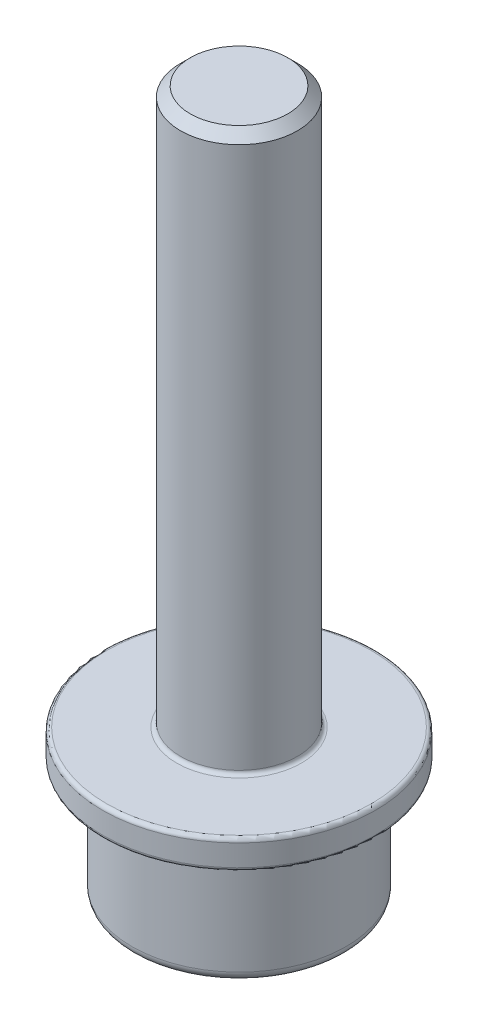
ISO-10303-21;
HEADER;
FILE_DESCRIPTION(('STEP AP214'),'2;1');
FILE_NAME('part.step','',(''),(''),'','','');
FILE_SCHEMA(('AUTOMOTIVE_DESIGN { 1 0 10303 214 1 1 1 1 }'));
ENDSEC;
DATA;
#1=APPLICATION_CONTEXT('core data for automotive mechanical design processes');
#2=APPLICATION_PROTOCOL_DEFINITION('international standard','automotive_design',2000,#1);
#3=PRODUCT_CONTEXT('',#1,'mechanical');
#4=PRODUCT('Part','Part','',(#3));
#5=PRODUCT_RELATED_PRODUCT_CATEGORY('part','',(#4));
#6=PRODUCT_DEFINITION_FORMATION('','',#4);
#7=PRODUCT_DEFINITION_CONTEXT('part definition',#1,'design');
#8=PRODUCT_DEFINITION('design','',#6,#7);
#9=PRODUCT_DEFINITION_SHAPE('','',#8);
#10=(LENGTH_UNIT() NAMED_UNIT(*) SI_UNIT(.MILLI.,.METRE.));
#11=(NAMED_UNIT(*) PLANE_ANGLE_UNIT() SI_UNIT($,.RADIAN.));
#12=(NAMED_UNIT(*) SI_UNIT($,.STERADIAN.) SOLID_ANGLE_UNIT());
#13=UNCERTAINTY_MEASURE_WITH_UNIT(LENGTH_MEASURE(1.E-05),#10,'distance_accuracy_value','');
#14=(GEOMETRIC_REPRESENTATION_CONTEXT(3) GLOBAL_UNCERTAINTY_ASSIGNED_CONTEXT((#13)) GLOBAL_UNIT_ASSIGNED_CONTEXT((#10,
#11,#12)) REPRESENTATION_CONTEXT('',''));
#15=CARTESIAN_POINT('',(0.,0.,0.));
#16=DIRECTION('',(0.,0.,1.));
#17=DIRECTION('',(1.,0.,0.));
#18=AXIS2_PLACEMENT_3D('',#15,#16,#17);
#19=CARTESIAN_POINT('',(0.,3.,0.));
#20=DIRECTION('',(0.,-1.,0.));
#21=DIRECTION('',(0.,0.,-1.));
#22=AXIS2_PLACEMENT_3D('',#19,#20,#21);
#23=CYLINDRICAL_SURFACE('',#22,2.75);
#24=CARTESIAN_POINT('',(0.,2.9,0.));
#25=DIRECTION('',(0.,1.,0.));
#26=DIRECTION('',(0.,0.,1.));
#27=AXIS2_PLACEMENT_3D('',#24,#25,#26);
#28=CIRCLE('',#27,2.75);
#29=CARTESIAN_POINT('',(0.,2.9,2.75));
#30=VERTEX_POINT('',#29);
#31=EDGE_CURVE('E201',#30,#30,#28,.F.);
#32=ORIENTED_EDGE('',*,*,#31,.T.);
#33=EDGE_LOOP('',(#32));
#34=FACE_BOUND('',#33,.T.);
#35=CARTESIAN_POINT('',(0.,0.25,0.));
#36=DIRECTION('',(0.,1.,0.));
#37=DIRECTION('',(0.,0.,1.));
#38=AXIS2_PLACEMENT_3D('',#35,#36,#37);
#39=CIRCLE('',#38,2.75);
#40=CARTESIAN_POINT('',(0.,0.25,2.75));
#41=VERTEX_POINT('',#40);
#42=EDGE_CURVE('E174',#41,#41,#39,.T.);
#43=ORIENTED_EDGE('',*,*,#42,.T.);
#44=EDGE_LOOP('',(#43));
#45=FACE_BOUND('',#44,.T.);
#46=ADVANCED_FACE('F33',(#34,#45),#23,.T.);
#47=CARTESIAN_POINT('',(0.,0.,0.));
#48=DIRECTION('',(0.,1.,0.));
#49=DIRECTION('',(0.,0.,1.));
#50=AXIS2_PLACEMENT_3D('',#47,#48,#49);
#51=PLANE('',#50);
#52=CARTESIAN_POINT('',(0.,0.,0.));
#53=DIRECTION('',(0.,1.,0.));
#54=DIRECTION('',(0.,0.,1.));
#55=AXIS2_PLACEMENT_3D('',#52,#53,#54);
#56=CIRCLE('',#55,2.5);
#57=CARTESIAN_POINT('',(0.,0.,2.5));
#58=VERTEX_POINT('',#57);
#59=EDGE_CURVE('E189',#58,#58,#56,.F.);
#60=ORIENTED_EDGE('',*,*,#59,.T.);
#61=EDGE_LOOP('',(#60));
#62=FACE_BOUND('',#61,.T.);
#63=DIRECTION('',(-0.69197693122312,0.,-0.721919612321922));
#64=VECTOR('',#63,1.);
#65=CARTESIAN_POINT('',(1.02450088015783,0.,-0.982008194523005));
#66=LINE('',#65,#64);
#67=CARTESIAN_POINT('',(1.5914635756121,0.,-0.390512335578875));
#68=VERTEX_POINT('',#67);
#69=CARTESIAN_POINT('',(0.457538184703551,0.,-1.57350405346713));
#70=VERTEX_POINT('',#69);
#71=EDGE_CURVE('E153',#68,#70,#66,.T.);
#72=ORIENTED_EDGE('',*,*,#71,.T.);
#73=DIRECTION('',(-0.971189189372558,0.,0.238309795111058));
#74=VECTOR('',#73,1.);
#75=CARTESIAN_POINT('',(-0.338193603102499,0.,-1.3782478856777));
#76=LINE('',#75,#74);
#77=CARTESIAN_POINT('',(-1.13392539090855,0.,-1.18299171788826));
#78=VERTEX_POINT('',#77);
#79=EDGE_CURVE('E163',#70,#78,#76,.T.);
#80=ORIENTED_EDGE('',*,*,#79,.T.);
#81=DIRECTION('',(-0.279212258149438,0.,0.96022940743298));
#82=VECTOR('',#81,1.);
#83=CARTESIAN_POINT('',(-1.36269448326033,0.,-0.396239691154692));
#84=LINE('',#83,#82);
#85=CARTESIAN_POINT('',(-1.5914635756121,0.,0.390512335578874));
#86=VERTEX_POINT('',#85);
#87=EDGE_CURVE('E161',#78,#86,#84,.T.);
#88=ORIENTED_EDGE('',*,*,#87,.T.);
#89=DIRECTION('',(0.69197693122312,0.,0.721919612321922));
#90=VECTOR('',#89,1.);
#91=CARTESIAN_POINT('',(-1.02450088015783,0.,0.982008194523004));
#92=LINE('',#91,#90);
#93=CARTESIAN_POINT('',(-0.457538184703551,0.,1.57350405346713));
#94=VERTEX_POINT('',#93);
#95=EDGE_CURVE('E159',#86,#94,#92,.T.);
#96=ORIENTED_EDGE('',*,*,#95,.T.);
#97=DIRECTION('',(0.971189189372558,0.,-0.238309795111058));
#98=VECTOR('',#97,1.);
#99=CARTESIAN_POINT('',(0.338193603102499,0.,1.3782478856777));
#100=LINE('',#99,#98);
#101=CARTESIAN_POINT('',(1.13392539090855,0.,1.18299171788826));
#102=VERTEX_POINT('',#101);
#103=EDGE_CURVE('E157',#94,#102,#100,.T.);
#104=ORIENTED_EDGE('',*,*,#103,.T.);
#105=DIRECTION('',(0.279212258149438,0.,-0.96022940743298));
#106=VECTOR('',#105,1.);
#107=CARTESIAN_POINT('',(1.36269448326033,0.,0.396239691154693));
#108=LINE('',#107,#106);
#109=EDGE_CURVE('E155',#102,#68,#108,.T.);
#110=ORIENTED_EDGE('',*,*,#109,.T.);
#111=EDGE_LOOP('',(#72,#80,#88,#96,#104,#110));
#112=FACE_BOUND('',#111,.T.);
#113=ADVANCED_FACE('F243',(#62,#112),#51,.F.);
#114=CARTESIAN_POINT('',(1.31110540565295,1.5,-0.321718223399928));
#115=DIRECTION('',(0.96022940743298,0.,0.279212258149438));
#116=DIRECTION('',(0.279212258149438,0.,-0.96022940743298));
#117=AXIS2_PLACEMENT_3D('',#114,#115,#116);
#118=PLANE('',#117);
#119=DIRECTION('',(0.,-1.,0.));
#120=VECTOR('',#119,1.);
#121=CARTESIAN_POINT('',(1.31110540565295,1.5,-0.321718223399928));
#122=LINE('',#121,#120);
#123=CARTESIAN_POINT('',(1.31110540565295,1.5,-0.321718223399928));
#124=VERTEX_POINT('',#123);
#125=CARTESIAN_POINT('',(1.31110540565295,0.249999999999999,-0.321718223399928));
#126=VERTEX_POINT('',#125);
#127=EDGE_CURVE('E139',#124,#126,#122,.T.);
#128=ORIENTED_EDGE('',*,*,#127,.T.);
#129=DIRECTION('',(-0.279212258149438,0.,0.96022940743298));
#130=VECTOR('',#129,1.);
#131=CARTESIAN_POINT('',(1.31110540565295,0.249999999999999,-0.321718223399928));
#132=LINE('',#131,#130);
#133=CARTESIAN_POINT('',(0.934168857151212,0.249999999999999,0.974591476634595));
#134=VERTEX_POINT('',#133);
#135=EDGE_CURVE('E55',#126,#134,#132,.T.);
#136=ORIENTED_EDGE('',*,*,#135,.T.);
#137=DIRECTION('',(0.,-1.,0.));
#138=VECTOR('',#137,1.);
#139=CARTESIAN_POINT('',(0.934168857151212,1.5,0.974591476634595));
#140=LINE('',#139,#138);
#141=CARTESIAN_POINT('',(0.934168857151212,1.5,0.974591476634595));
#142=VERTEX_POINT('',#141);
#143=EDGE_CURVE('E103',#142,#134,#140,.T.);
#144=ORIENTED_EDGE('',*,*,#143,.F.);
#145=DIRECTION('',(-0.279212258149438,0.,0.96022940743298));
#146=VECTOR('',#145,1.);
#147=CARTESIAN_POINT('',(1.31110540565295,1.5,-0.321718223399928));
#148=LINE('',#147,#146);
#149=EDGE_CURVE('E107',#124,#142,#148,.T.);
#150=ORIENTED_EDGE('',*,*,#149,.F.);
#151=EDGE_LOOP('',(#128,#136,#144,#150));
#152=FACE_BOUND('',#151,.T.);
#153=ADVANCED_FACE('F105',(#152),#118,.F.);
#154=CARTESIAN_POINT('',(0.376936548501741,1.5,-1.29630970003452));
#155=DIRECTION('',(0.721919612321922,0.,-0.69197693122312));
#156=DIRECTION('',(-0.69197693122312,0.,-0.721919612321922));
#157=AXIS2_PLACEMENT_3D('',#154,#155,#156);
#158=PLANE('',#157);
#159=DIRECTION('',(0.,-1.,0.));
#160=VECTOR('',#159,1.);
#161=CARTESIAN_POINT('',(0.376936548501741,1.5,-1.29630970003452));
#162=LINE('',#161,#160);
#163=CARTESIAN_POINT('',(0.376936548501741,1.5,-1.29630970003452));
#164=VERTEX_POINT('',#163);
#165=CARTESIAN_POINT('',(0.376936548501741,0.249999999999999,-1.29630970003452));
#166=VERTEX_POINT('',#165);
#167=EDGE_CURVE('E142',#164,#166,#162,.T.);
#168=ORIENTED_EDGE('',*,*,#167,.T.);
#169=DIRECTION('',(0.69197693122312,0.,0.721919612321922));
#170=VECTOR('',#169,1.);
#171=CARTESIAN_POINT('',(0.376936548501741,0.249999999999999,-1.29630970003452));
#172=LINE('',#171,#170);
#173=EDGE_CURVE('E48',#166,#126,#172,.T.);
#174=ORIENTED_EDGE('',*,*,#173,.T.);
#175=ORIENTED_EDGE('',*,*,#127,.F.);
#176=DIRECTION('',(0.69197693122312,0.,0.721919612321922));
#177=VECTOR('',#176,1.);
#178=CARTESIAN_POINT('',(0.376936548501741,1.5,-1.29630970003452));
#179=LINE('',#178,#177);
#180=EDGE_CURVE('E112',#164,#124,#179,.T.);
#181=ORIENTED_EDGE('',*,*,#180,.F.);
#182=EDGE_LOOP('',(#168,#174,#175,#181));
#183=FACE_BOUND('',#182,.T.);
#184=ADVANCED_FACE('F310',(#183),#158,.F.);
#185=CARTESIAN_POINT('',(-0.934168857151211,1.5,-0.974591476634595));
#186=DIRECTION('',(-0.238309795111058,0.,-0.971189189372557));
#187=DIRECTION('',(-0.971189189372558,0.,0.238309795111058));
#188=AXIS2_PLACEMENT_3D('',#185,#186,#187);
#189=PLANE('',#188);
#190=DIRECTION('',(0.,-1.,0.));
#191=VECTOR('',#190,1.);
#192=CARTESIAN_POINT('',(-0.934168857151211,1.5,-0.974591476634595));
#193=LINE('',#192,#191);
#194=CARTESIAN_POINT('',(-0.934168857151211,1.5,-0.974591476634595));
#195=VERTEX_POINT('',#194);
#196=CARTESIAN_POINT('',(-0.934168857151211,0.249999999999999,-0.974591476634595));
#197=VERTEX_POINT('',#196);
#198=EDGE_CURVE('E144',#195,#197,#193,.T.);
#199=ORIENTED_EDGE('',*,*,#198,.T.);
#200=DIRECTION('',(0.971189189372558,0.,-0.238309795111058));
#201=VECTOR('',#200,1.);
#202=CARTESIAN_POINT('',(-0.934168857151211,0.249999999999999,-0.974591476634595));
#203=LINE('',#202,#201);
#204=EDGE_CURVE('E141',#197,#166,#203,.T.);
#205=ORIENTED_EDGE('',*,*,#204,.T.);
#206=ORIENTED_EDGE('',*,*,#167,.F.);
#207=DIRECTION('',(0.971189189372558,0.,-0.238309795111058));
#208=VECTOR('',#207,1.);
#209=CARTESIAN_POINT('',(-0.934168857151211,1.5,-0.974591476634595));
#210=LINE('',#209,#208);
#211=EDGE_CURVE('E136',#195,#164,#210,.T.);
#212=ORIENTED_EDGE('',*,*,#211,.F.);
#213=EDGE_LOOP('',(#199,#205,#206,#212));
#214=FACE_BOUND('',#213,.T.);
#215=ADVANCED_FACE('F320',(#214),#189,.F.);
#216=CARTESIAN_POINT('',(-1.31110540565295,1.5,0.321718223399928));
#217=DIRECTION('',(-0.96022940743298,0.,-0.279212258149438));
#218=DIRECTION('',(-0.279212258149438,0.,0.96022940743298));
#219=AXIS2_PLACEMENT_3D('',#216,#217,#218);
#220=PLANE('',#219);
#221=DIRECTION('',(0.,-1.,0.));
#222=VECTOR('',#221,1.);
#223=CARTESIAN_POINT('',(-1.31110540565295,1.5,0.321718223399928));
#224=LINE('',#223,#222);
#225=CARTESIAN_POINT('',(-1.31110540565295,1.5,0.321718223399928));
#226=VERTEX_POINT('',#225);
#227=CARTESIAN_POINT('',(-1.31110540565295,0.249999999999999,0.321718223399928));
#228=VERTEX_POINT('',#227);
#229=EDGE_CURVE('E147',#226,#228,#224,.T.);
#230=ORIENTED_EDGE('',*,*,#229,.T.);
#231=DIRECTION('',(0.279212258149438,0.,-0.96022940743298));
#232=VECTOR('',#231,1.);
#233=CARTESIAN_POINT('',(-1.31110540565295,0.249999999999999,0.321718223399928));
#234=LINE('',#233,#232);
#235=EDGE_CURVE('E166',#228,#197,#234,.T.);
#236=ORIENTED_EDGE('',*,*,#235,.T.);
#237=ORIENTED_EDGE('',*,*,#198,.F.);
#238=DIRECTION('',(0.279212258149438,0.,-0.96022940743298));
#239=VECTOR('',#238,1.);
#240=CARTESIAN_POINT('',(-1.31110540565295,1.5,0.321718223399928));
#241=LINE('',#240,#239);
#242=EDGE_CURVE('E133',#226,#195,#241,.T.);
#243=ORIENTED_EDGE('',*,*,#242,.F.);
#244=EDGE_LOOP('',(#230,#236,#237,#243));
#245=FACE_BOUND('',#244,.T.);
#246=ADVANCED_FACE('F316',(#245),#220,.F.);
#247=CARTESIAN_POINT('',(-0.376936548501741,1.5,1.29630970003452));
#248=DIRECTION('',(-0.721919612321922,0.,0.69197693122312));
#249=DIRECTION('',(0.69197693122312,0.,0.721919612321922));
#250=AXIS2_PLACEMENT_3D('',#247,#248,#249);
#251=PLANE('',#250);
#252=DIRECTION('',(0.,-1.,0.));
#253=VECTOR('',#252,1.);
#254=CARTESIAN_POINT('',(-0.376936548501741,1.5,1.29630970003452));
#255=LINE('',#254,#253);
#256=CARTESIAN_POINT('',(-0.376936548501741,1.5,1.29630970003452));
#257=VERTEX_POINT('',#256);
#258=CARTESIAN_POINT('',(-0.376936548501741,0.249999999999999,1.29630970003452));
#259=VERTEX_POINT('',#258);
#260=EDGE_CURVE('E111',#257,#259,#255,.T.);
#261=ORIENTED_EDGE('',*,*,#260,.T.);
#262=DIRECTION('',(-0.69197693122312,0.,-0.721919612321922));
#263=VECTOR('',#262,1.);
#264=CARTESIAN_POINT('',(-0.376936548501741,0.249999999999999,1.29630970003452));
#265=LINE('',#264,#263);
#266=EDGE_CURVE('E168',#259,#228,#265,.T.);
#267=ORIENTED_EDGE('',*,*,#266,.T.);
#268=ORIENTED_EDGE('',*,*,#229,.F.);
#269=DIRECTION('',(-0.69197693122312,0.,-0.721919612321922));
#270=VECTOR('',#269,1.);
#271=CARTESIAN_POINT('',(-0.376936548501741,1.5,1.29630970003452));
#272=LINE('',#271,#270);
#273=EDGE_CURVE('E121',#257,#226,#272,.T.);
#274=ORIENTED_EDGE('',*,*,#273,.F.);
#275=EDGE_LOOP('',(#261,#267,#268,#274));
#276=FACE_BOUND('',#275,.T.);
#277=ADVANCED_FACE('F313',(#276),#251,.F.);
#278=CARTESIAN_POINT('',(0.934168857151212,1.5,0.974591476634595));
#279=DIRECTION('',(0.238309795111058,0.,0.971189189372558));
#280=DIRECTION('',(0.971189189372558,0.,-0.238309795111058));
#281=AXIS2_PLACEMENT_3D('',#278,#279,#280);
#282=PLANE('',#281);
#283=ORIENTED_EDGE('',*,*,#143,.T.);
#284=DIRECTION('',(-0.971189189372558,0.,0.238309795111058));
#285=VECTOR('',#284,1.);
#286=CARTESIAN_POINT('',(0.934168857151212,0.249999999999999,0.974591476634595));
#287=LINE('',#286,#285);
#288=EDGE_CURVE('E170',#134,#259,#287,.T.);
#289=ORIENTED_EDGE('',*,*,#288,.T.);
#290=ORIENTED_EDGE('',*,*,#260,.F.);
#291=DIRECTION('',(-0.971189189372557,0.,0.238309795111058));
#292=VECTOR('',#291,1.);
#293=CARTESIAN_POINT('',(0.934168857151212,1.5,0.974591476634595));
#294=LINE('',#293,#292);
#295=EDGE_CURVE('E115',#142,#257,#294,.T.);
#296=ORIENTED_EDGE('',*,*,#295,.F.);
#297=EDGE_LOOP('',(#283,#289,#290,#296));
#298=FACE_BOUND('',#297,.T.);
#299=ADVANCED_FACE('F116',(#298),#282,.F.);
#300=CARTESIAN_POINT('',(0.,1.5,0.));
#301=DIRECTION('',(0.,-1.,0.));
#302=DIRECTION('',(0.,0.,-1.));
#303=AXIS2_PLACEMENT_3D('',#300,#301,#302);
#304=PLANE('',#303);
#305=ORIENTED_EDGE('',*,*,#149,.T.);
#306=ORIENTED_EDGE('',*,*,#295,.T.);
#307=ORIENTED_EDGE('',*,*,#273,.T.);
#308=ORIENTED_EDGE('',*,*,#242,.T.);
#309=ORIENTED_EDGE('',*,*,#211,.T.);
#310=ORIENTED_EDGE('',*,*,#180,.T.);
#311=EDGE_LOOP('',(#305,#306,#307,#308,#309,#310));
#312=FACE_BOUND('',#311,.T.);
#313=ADVANCED_FACE('F123',(#312),#304,.T.);
#314=CARTESIAN_POINT('',(0.934168857151212,0.249999999999999,0.974591476634595));
#315=DIRECTION('',(0.168510472146206,0.707106781186547,0.686734461620402));
#316=DIRECTION('',(-0.971189189372558,0.,0.238309795111058));
#317=AXIS2_PLACEMENT_3D('',#314,#315,#316);
#318=PLANE('',#317);
#319=DIRECTION('',(-0.523085392288578,0.654653670707977,-0.545719931652561));
#320=VECTOR('',#319,1.);
#321=CARTESIAN_POINT('',(0.934168857151212,0.249999999999999,0.974591476634595));
#322=LINE('',#321,#320);
#323=EDGE_CURVE('E129',#102,#134,#322,.T.);
#324=ORIENTED_EDGE('',*,*,#323,.F.);
#325=ORIENTED_EDGE('',*,*,#103,.F.);
#326=DIRECTION('',(0.211064628018337,0.654653670707977,-0.725865203896737));
#327=VECTOR('',#326,1.);
#328=CARTESIAN_POINT('',(-0.376936548501741,0.249999999999999,1.29630970003452));
#329=LINE('',#328,#327);
#330=EDGE_CURVE('E126',#259,#94,#329,.F.);
#331=ORIENTED_EDGE('',*,*,#330,.F.);
#332=ORIENTED_EDGE('',*,*,#288,.F.);
#333=EDGE_LOOP('',(#324,#325,#331,#332));
#334=FACE_BOUND('',#333,.T.);
#335=ADVANCED_FACE('F273',(#334),#318,.F.);
#336=CARTESIAN_POINT('',(-0.376936548501741,0.249999999999999,1.29630970003452));
#337=DIRECTION('',(-0.510474253344395,0.707106781186547,0.489301580492525));
#338=DIRECTION('',(-0.69197693122312,0.,-0.721919612321922));
#339=AXIS2_PLACEMENT_3D('',#336,#337,#338);
#340=PLANE('',#339);
#341=ORIENTED_EDGE('',*,*,#330,.T.);
#342=ORIENTED_EDGE('',*,*,#95,.F.);
#343=DIRECTION('',(0.734150020306915,0.654653670707977,-0.180145272244175));
#344=VECTOR('',#343,1.);
#345=CARTESIAN_POINT('',(-1.31110540565295,0.249999999999999,0.321718223399928));
#346=LINE('',#345,#344);
#347=EDGE_CURVE('E182',#228,#86,#346,.F.);
#348=ORIENTED_EDGE('',*,*,#347,.F.);
#349=ORIENTED_EDGE('',*,*,#266,.F.);
#350=EDGE_LOOP('',(#341,#342,#348,#349));
#351=FACE_BOUND('',#350,.T.);
#352=ADVANCED_FACE('F269',(#351),#340,.F.);
#353=CARTESIAN_POINT('',(1.31110540565295,0.249999999999999,-0.321718223399928));
#354=DIRECTION('',(0.6789847254906,0.707106781186548,0.197432881127876));
#355=DIRECTION('',(-0.279212258149438,0.,0.96022940743298));
#356=AXIS2_PLACEMENT_3D('',#353,#354,#355);
#357=PLANE('',#356);
#358=ORIENTED_EDGE('',*,*,#323,.T.);
#359=ORIENTED_EDGE('',*,*,#135,.F.);
#360=DIRECTION('',(-0.734150020306915,0.654653670707977,0.180145272244175));
#361=VECTOR('',#360,1.);
#362=CARTESIAN_POINT('',(1.31110540565295,0.249999999999999,-0.321718223399928));
#363=LINE('',#362,#361);
#364=EDGE_CURVE('E179',#68,#126,#363,.T.);
#365=ORIENTED_EDGE('',*,*,#364,.F.);
#366=ORIENTED_EDGE('',*,*,#109,.F.);
#367=EDGE_LOOP('',(#358,#359,#365,#366));
#368=FACE_BOUND('',#367,.T.);
#369=ADVANCED_FACE('F265',(#368),#357,.F.);
#370=CARTESIAN_POINT('',(-1.31110540565295,0.249999999999999,0.321718223399928));
#371=DIRECTION('',(-0.6789847254906,0.707106781186548,-0.197432881127876));
#372=DIRECTION('',(0.279212258149438,0.,-0.96022940743298));
#373=AXIS2_PLACEMENT_3D('',#370,#371,#372);
#374=PLANE('',#373);
#375=ORIENTED_EDGE('',*,*,#347,.T.);
#376=ORIENTED_EDGE('',*,*,#87,.F.);
#377=DIRECTION('',(0.523085392288578,0.654653670707977,0.545719931652561));
#378=VECTOR('',#377,1.);
#379=CARTESIAN_POINT('',(-0.934168857151211,0.249999999999999,-0.974591476634595));
#380=LINE('',#379,#378);
#381=EDGE_CURVE('E177',#197,#78,#380,.F.);
#382=ORIENTED_EDGE('',*,*,#381,.F.);
#383=ORIENTED_EDGE('',*,*,#235,.F.);
#384=EDGE_LOOP('',(#375,#376,#382,#383));
#385=FACE_BOUND('',#384,.T.);
#386=ADVANCED_FACE('F261',(#385),#374,.F.);
#387=CARTESIAN_POINT('',(0.376936548501741,0.249999999999999,-1.29630970003452));
#388=DIRECTION('',(0.510474253344394,0.707106781186547,-0.489301580492525));
#389=DIRECTION('',(0.69197693122312,0.,0.721919612321922));
#390=AXIS2_PLACEMENT_3D('',#387,#388,#389);
#391=PLANE('',#390);
#392=ORIENTED_EDGE('',*,*,#364,.T.);
#393=ORIENTED_EDGE('',*,*,#173,.F.);
#394=DIRECTION('',(0.211064628018337,-0.654653670707977,-0.725865203896737));
#395=VECTOR('',#394,1.);
#396=CARTESIAN_POINT('',(0.269240391786958,0.584038370031139,-0.92593550002466));
#397=LINE('',#396,#395);
#398=EDGE_CURVE('E175',#70,#166,#397,.F.);
#399=ORIENTED_EDGE('',*,*,#398,.F.);
#400=ORIENTED_EDGE('',*,*,#71,.F.);
#401=EDGE_LOOP('',(#392,#393,#399,#400));
#402=FACE_BOUND('',#401,.T.);
#403=ADVANCED_FACE('F257',(#402),#391,.F.);
#404=CARTESIAN_POINT('',(-0.934168857151211,0.249999999999999,-0.974591476634595));
#405=DIRECTION('',(-0.168510472146206,0.707106781186547,-0.686734461620402));
#406=DIRECTION('',(0.971189189372558,0.,-0.238309795111058));
#407=AXIS2_PLACEMENT_3D('',#404,#405,#406);
#408=PLANE('',#407);
#409=ORIENTED_EDGE('',*,*,#381,.T.);
#410=ORIENTED_EDGE('',*,*,#79,.F.);
#411=ORIENTED_EDGE('',*,*,#398,.T.);
#412=ORIENTED_EDGE('',*,*,#204,.F.);
#413=EDGE_LOOP('',(#409,#410,#411,#412));
#414=FACE_BOUND('',#413,.T.);
#415=ADVANCED_FACE('F254',(#414),#408,.F.);
#416=CARTESIAN_POINT('',(0.,0.25,0.));
#417=DIRECTION('',(0.,1.,0.));
#418=DIRECTION('',(0.,0.,1.));
#419=AXIS2_PLACEMENT_3D('',#416,#417,#418);
#420=TOROIDAL_SURFACE('',#419,2.5,0.25);
#421=ORIENTED_EDGE('',*,*,#59,.F.);
#422=EDGE_LOOP('',(#421));
#423=FACE_BOUND('',#422,.T.);
#424=ORIENTED_EDGE('',*,*,#42,.F.);
#425=EDGE_LOOP('',(#424));
#426=FACE_BOUND('',#425,.T.);
#427=ADVANCED_FACE('F239',(#423,#426),#420,.T.);
#428=CARTESIAN_POINT('',(0.,2.9,0.));
#429=DIRECTION('',(0.,1.,0.));
#430=DIRECTION('',(0.,0.,1.));
#431=AXIS2_PLACEMENT_3D('',#428,#429,#430);
#432=TOROIDAL_SURFACE('',#431,2.65,0.1);
#433=ORIENTED_EDGE('',*,*,#31,.F.);
#434=EDGE_LOOP('',(#433));
#435=FACE_BOUND('',#434,.T.);
#436=CARTESIAN_POINT('',(0.,3.,0.));
#437=DIRECTION('',(0.,1.,0.));
#438=DIRECTION('',(0.,0.,1.));
#439=AXIS2_PLACEMENT_3D('',#436,#437,#438);
#440=CIRCLE('',#439,2.65);
#441=CARTESIAN_POINT('',(0.,3.,2.65));
#442=VERTEX_POINT('',#441);
#443=EDGE_CURVE('E198',#442,#442,#440,.T.);
#444=ORIENTED_EDGE('',*,*,#443,.F.);
#445=EDGE_LOOP('',(#444));
#446=FACE_BOUND('',#445,.T.);
#447=ADVANCED_FACE('F230',(#435,#446),#432,.T.);
#448=CARTESIAN_POINT('',(0.,3.75,0.));
#449=DIRECTION('',(0.,1.,0.));
#450=DIRECTION('',(0.,0.,1.));
#451=AXIS2_PLACEMENT_3D('',#448,#449,#450);
#452=PLANE('',#451);
#453=CARTESIAN_POINT('',(0.,3.75,0.));
#454=DIRECTION('',(0.,1.,0.));
#455=DIRECTION('',(0.,0.,1.));
#456=AXIS2_PLACEMENT_3D('',#453,#454,#455);
#457=CIRCLE('',#456,1.6);
#458=CARTESIAN_POINT('',(0.,3.75,1.6));
#459=VERTEX_POINT('',#458);
#460=EDGE_CURVE('E210',#459,#459,#457,.F.);
#461=ORIENTED_EDGE('',*,*,#460,.T.);
#462=EDGE_LOOP('',(#461));
#463=FACE_BOUND('',#462,.T.);
#464=CARTESIAN_POINT('',(0.,3.75,0.));
#465=DIRECTION('',(0.,1.,0.));
#466=DIRECTION('',(0.,0.,1.));
#467=AXIS2_PLACEMENT_3D('',#464,#465,#466);
#468=CIRCLE('',#467,3.4);
#469=CARTESIAN_POINT('',(0.,3.75,3.4));
#470=VERTEX_POINT('',#469);
#471=EDGE_CURVE('E207',#470,#470,#468,.T.);
#472=ORIENTED_EDGE('',*,*,#471,.T.);
#473=EDGE_LOOP('',(#472));
#474=FACE_BOUND('',#473,.T.);
#475=ADVANCED_FACE('F227',(#463,#474),#452,.T.);
#476=CARTESIAN_POINT('',(0.,3.,0.));
#477=DIRECTION('',(0.,1.,0.));
#478=DIRECTION('',(0.,0.,1.));
#479=AXIS2_PLACEMENT_3D('',#476,#477,#478);
#480=PLANE('',#479);
#481=CARTESIAN_POINT('',(0.,3.,0.));
#482=DIRECTION('',(0.,1.,0.));
#483=DIRECTION('',(0.,0.,1.));
#484=AXIS2_PLACEMENT_3D('',#481,#482,#483);
#485=CIRCLE('',#484,3.4);
#486=CARTESIAN_POINT('',(0.,3.,3.4));
#487=VERTEX_POINT('',#486);
#488=EDGE_CURVE('E11',#487,#487,#485,.F.);
#489=ORIENTED_EDGE('',*,*,#488,.T.);
#490=EDGE_LOOP('',(#489));
#491=FACE_BOUND('',#490,.T.);
#492=ORIENTED_EDGE('',*,*,#443,.T.);
#493=EDGE_LOOP('',(#492));
#494=FACE_BOUND('',#493,.T.);
#495=ADVANCED_FACE('F229',(#491,#494),#480,.F.);
#496=CARTESIAN_POINT('',(0.,3.75,0.));
#497=DIRECTION('',(0.,-1.,0.));
#498=DIRECTION('',(0.,0.,-1.));
#499=AXIS2_PLACEMENT_3D('',#496,#497,#498);
#500=CYLINDRICAL_SURFACE('',#499,3.5);
#501=CARTESIAN_POINT('',(0.,3.65,0.));
#502=DIRECTION('',(0.,1.,0.));
#503=DIRECTION('',(0.,0.,1.));
#504=AXIS2_PLACEMENT_3D('',#501,#502,#503);
#505=CIRCLE('',#504,3.5);
#506=CARTESIAN_POINT('',(0.,3.65,3.5));
#507=VERTEX_POINT('',#506);
#508=EDGE_CURVE('E41',#507,#507,#505,.F.);
#509=ORIENTED_EDGE('',*,*,#508,.T.);
#510=EDGE_LOOP('',(#509));
#511=FACE_BOUND('',#510,.T.);
#512=CARTESIAN_POINT('',(0.,3.1,0.));
#513=DIRECTION('',(0.,1.,0.));
#514=DIRECTION('',(0.,0.,1.));
#515=AXIS2_PLACEMENT_3D('',#512,#513,#514);
#516=CIRCLE('',#515,3.5);
#517=CARTESIAN_POINT('',(0.,3.1,3.5));
#518=VERTEX_POINT('',#517);
#519=EDGE_CURVE('E213',#518,#518,#516,.T.);
#520=ORIENTED_EDGE('',*,*,#519,.T.);
#521=EDGE_LOOP('',(#520));
#522=FACE_BOUND('',#521,.T.);
#523=ADVANCED_FACE('F218',(#511,#522),#500,.T.);
#524=CARTESIAN_POINT('',(0.,18.,0.));
#525=DIRECTION('',(0.,1.,0.));
#526=DIRECTION('',(0.,0.,1.));
#527=AXIS2_PLACEMENT_3D('',#524,#525,#526);
#528=PLANE('',#527);
#529=CARTESIAN_POINT('',(0.,18.,0.));
#530=DIRECTION('',(0.,1.,0.));
#531=DIRECTION('',(0.,0.,1.));
#532=AXIS2_PLACEMENT_3D('',#529,#530,#531);
#533=CIRCLE('',#532,1.25);
#534=CARTESIAN_POINT('',(0.,18.,1.25));
#535=VERTEX_POINT('',#534);
#536=EDGE_CURVE('E192',#535,#535,#533,.T.);
#537=ORIENTED_EDGE('',*,*,#536,.T.);
#538=EDGE_LOOP('',(#537));
#539=FACE_BOUND('',#538,.T.);
#540=ADVANCED_FACE('F284',(#539),#528,.T.);
#541=CARTESIAN_POINT('',(0.,18.,0.));
#542=DIRECTION('',(0.,-1.,0.));
#543=DIRECTION('',(0.,0.,-1.));
#544=AXIS2_PLACEMENT_3D('',#541,#542,#543);
#545=CONICAL_SURFACE('',#544,1.25,0.785398163397446);
#546=CARTESIAN_POINT('',(0.,17.75,0.));
#547=DIRECTION('',(0.,1.,0.));
#548=DIRECTION('',(0.,0.,1.));
#549=AXIS2_PLACEMENT_3D('',#546,#547,#548);
#550=CIRCLE('',#549,1.5);
#551=CARTESIAN_POINT('',(0.,17.75,1.5));
#552=VERTEX_POINT('',#551);
#553=EDGE_CURVE('E195',#552,#552,#550,.F.);
#554=ORIENTED_EDGE('',*,*,#553,.F.);
#555=EDGE_LOOP('',(#554));
#556=FACE_BOUND('',#555,.T.);
#557=ORIENTED_EDGE('',*,*,#536,.F.);
#558=EDGE_LOOP('',(#557));
#559=FACE_BOUND('',#558,.T.);
#560=ADVANCED_FACE('F281',(#556,#559),#545,.T.);
#561=CARTESIAN_POINT('',(0.,18.,0.));
#562=DIRECTION('',(0.,-1.,0.));
#563=DIRECTION('',(0.,0.,-1.));
#564=AXIS2_PLACEMENT_3D('',#561,#562,#563);
#565=CYLINDRICAL_SURFACE('',#564,1.5);
#566=CARTESIAN_POINT('',(0.,3.85,0.));
#567=DIRECTION('',(0.,1.,0.));
#568=DIRECTION('',(0.,0.,1.));
#569=AXIS2_PLACEMENT_3D('',#566,#567,#568);
#570=CIRCLE('',#569,1.5);
#571=CARTESIAN_POINT('',(0.,3.85,1.5));
#572=VERTEX_POINT('',#571);
#573=EDGE_CURVE('E204',#572,#572,#570,.T.);
#574=ORIENTED_EDGE('',*,*,#573,.T.);
#575=EDGE_LOOP('',(#574));
#576=FACE_BOUND('',#575,.T.);
#577=ORIENTED_EDGE('',*,*,#553,.T.);
#578=EDGE_LOOP('',(#577));
#579=FACE_BOUND('',#578,.T.);
#580=ADVANCED_FACE('F283',(#576,#579),#565,.T.);
#581=CARTESIAN_POINT('',(0.,3.85,0.));
#582=DIRECTION('',(0.,1.,0.));
#583=DIRECTION('',(0.,0.,1.));
#584=AXIS2_PLACEMENT_3D('',#581,#582,#583);
#585=TOROIDAL_SURFACE('',#584,1.6,0.1);
#586=ORIENTED_EDGE('',*,*,#460,.F.);
#587=EDGE_LOOP('',(#586));
#588=FACE_BOUND('',#587,.T.);
#589=ORIENTED_EDGE('',*,*,#573,.F.);
#590=EDGE_LOOP('',(#589));
#591=FACE_BOUND('',#590,.T.);
#592=ADVANCED_FACE('F224',(#588,#591),#585,.F.);
#593=CARTESIAN_POINT('',(0.,3.65,0.));
#594=DIRECTION('',(0.,1.,0.));
#595=DIRECTION('',(0.,0.,1.));
#596=AXIS2_PLACEMENT_3D('',#593,#594,#595);
#597=TOROIDAL_SURFACE('',#596,3.4,0.1);
#598=ORIENTED_EDGE('',*,*,#508,.F.);
#599=EDGE_LOOP('',(#598));
#600=FACE_BOUND('',#599,.T.);
#601=ORIENTED_EDGE('',*,*,#471,.F.);
#602=EDGE_LOOP('',(#601));
#603=FACE_BOUND('',#602,.T.);
#604=ADVANCED_FACE('F221',(#600,#603),#597,.T.);
#605=CARTESIAN_POINT('',(0.,3.1,0.));
#606=DIRECTION('',(0.,1.,0.));
#607=DIRECTION('',(0.,0.,1.));
#608=AXIS2_PLACEMENT_3D('',#605,#606,#607);
#609=TOROIDAL_SURFACE('',#608,3.4,0.1);
#610=ORIENTED_EDGE('',*,*,#488,.F.);
#611=EDGE_LOOP('',(#610));
#612=FACE_BOUND('',#611,.T.);
#613=ORIENTED_EDGE('',*,*,#519,.F.);
#614=EDGE_LOOP('',(#613));
#615=FACE_BOUND('',#614,.T.);
#616=ADVANCED_FACE('F35',(#612,#615),#609,.T.);
#617=CLOSED_SHELL('',(#46,#113,#153,#184,#215,#246,#277,#299,#313,#335,#352,#369,#386,#403,#415,
#427,#447,#475,#495,#523,#540,#560,#580,#592,#604,#616));
#618=MANIFOLD_SOLID_BREP('B2',#617);
#619=ADVANCED_BREP_SHAPE_REPRESENTATION('',(#18,#618),#14);
#620=SHAPE_DEFINITION_REPRESENTATION(#9,#619);
ENDSEC;
END-ISO-10303-21;
